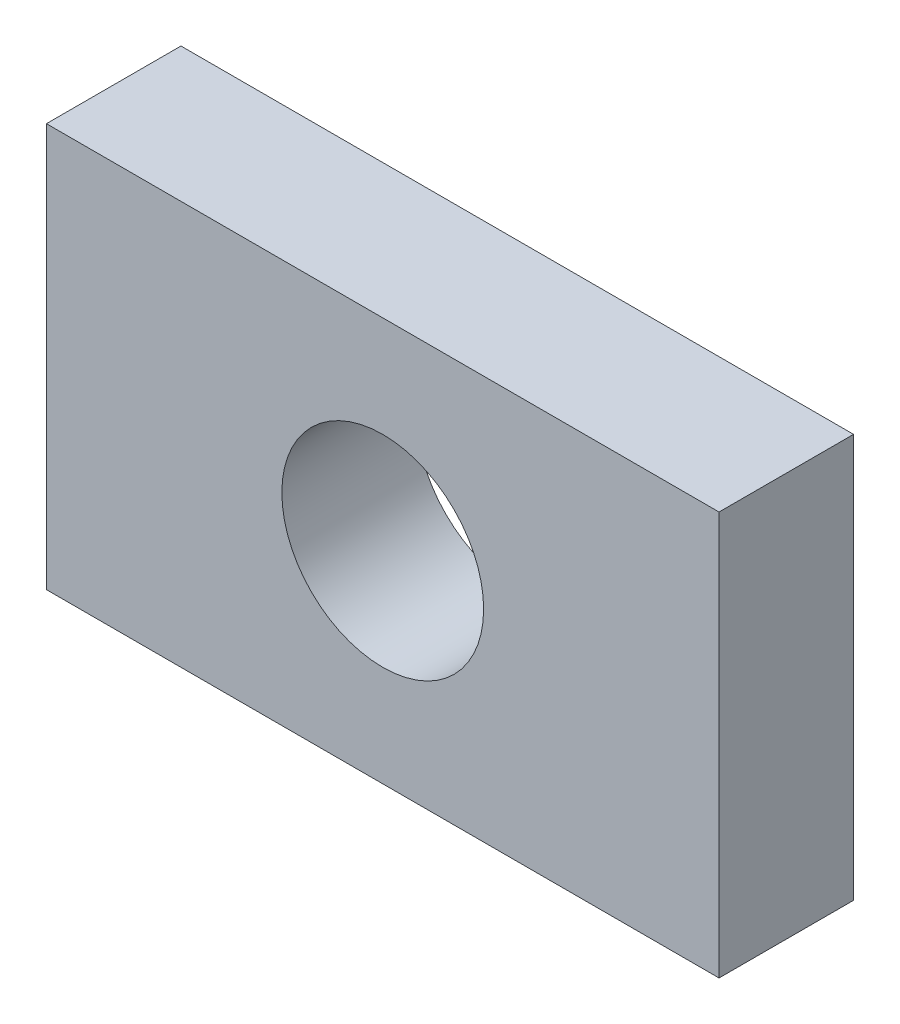
ISO-10303-21;
HEADER;
FILE_DESCRIPTION(('STEP AP214'),'2;1');
FILE_NAME('part.step','',(''),(''),'','','');
FILE_SCHEMA(('AUTOMOTIVE_DESIGN { 1 0 10303 214 1 1 1 1 }'));
ENDSEC;
DATA;
#1=APPLICATION_CONTEXT('core data for automotive mechanical design processes');
#2=APPLICATION_PROTOCOL_DEFINITION('international standard','automotive_design',2000,#1);
#3=PRODUCT_CONTEXT('',#1,'mechanical');
#4=PRODUCT('Part','Part','',(#3));
#5=PRODUCT_RELATED_PRODUCT_CATEGORY('part','',(#4));
#6=PRODUCT_DEFINITION_FORMATION('','',#4);
#7=PRODUCT_DEFINITION_CONTEXT('part definition',#1,'design');
#8=PRODUCT_DEFINITION('design','',#6,#7);
#9=PRODUCT_DEFINITION_SHAPE('','',#8);
#10=(LENGTH_UNIT() NAMED_UNIT(*) SI_UNIT(.MILLI.,.METRE.));
#11=(NAMED_UNIT(*) PLANE_ANGLE_UNIT() SI_UNIT($,.RADIAN.));
#12=(NAMED_UNIT(*) SI_UNIT($,.STERADIAN.) SOLID_ANGLE_UNIT());
#13=UNCERTAINTY_MEASURE_WITH_UNIT(LENGTH_MEASURE(1.E-05),#10,'distance_accuracy_value','');
#14=(GEOMETRIC_REPRESENTATION_CONTEXT(3) GLOBAL_UNCERTAINTY_ASSIGNED_CONTEXT((#13)) GLOBAL_UNIT_ASSIGNED_CONTEXT((#10,
#11,#12)) REPRESENTATION_CONTEXT('',''));
#15=CARTESIAN_POINT('',(0.,0.,0.));
#16=DIRECTION('',(0.,0.,1.));
#17=DIRECTION('',(1.,0.,0.));
#18=AXIS2_PLACEMENT_3D('',#15,#16,#17);
#19=CARTESIAN_POINT('',(0.,0.,2.));
#20=DIRECTION('',(0.,0.,-1.));
#21=DIRECTION('',(-1.,0.,0.));
#22=AXIS2_PLACEMENT_3D('',#19,#20,#21);
#23=PLANE('',#22);
#24=DIRECTION('',(-1.,0.,0.));
#25=VECTOR('',#24,1.);
#26=CARTESIAN_POINT('',(2078.67595263579,1309.13833772904,2.));
#27=LINE('',#26,#25);
#28=CARTESIAN_POINT('',(2088.67595263579,1309.13833772904,2.));
#29=VERTEX_POINT('',#28);
#30=CARTESIAN_POINT('',(2078.67595263579,1309.13833772904,2.));
#31=VERTEX_POINT('',#30);
#32=EDGE_CURVE('E88',#29,#31,#27,.T.);
#33=ORIENTED_EDGE('',*,*,#32,.T.);
#34=DIRECTION('',(0.,-1.,0.));
#35=VECTOR('',#34,1.);
#36=CARTESIAN_POINT('',(2078.67595263579,1309.13833772904,2.));
#37=LINE('',#36,#35);
#38=CARTESIAN_POINT('',(2078.67595263579,1303.13833772904,2.));
#39=VERTEX_POINT('',#38);
#40=EDGE_CURVE('E83',#31,#39,#37,.T.);
#41=ORIENTED_EDGE('',*,*,#40,.T.);
#42=DIRECTION('',(1.,0.,0.));
#43=VECTOR('',#42,1.);
#44=CARTESIAN_POINT('',(2088.67595263579,1303.13833772904,2.));
#45=LINE('',#44,#43);
#46=CARTESIAN_POINT('',(2088.67595263579,1303.13833772904,2.));
#47=VERTEX_POINT('',#46);
#48=EDGE_CURVE('E86',#39,#47,#45,.T.);
#49=ORIENTED_EDGE('',*,*,#48,.T.);
#50=DIRECTION('',(0.,1.,0.));
#51=VECTOR('',#50,1.);
#52=CARTESIAN_POINT('',(2088.67595263579,1309.13833772904,2.));
#53=LINE('',#52,#51);
#54=EDGE_CURVE('E53',#47,#29,#53,.T.);
#55=ORIENTED_EDGE('',*,*,#54,.T.);
#56=EDGE_LOOP('',(#33,#41,#49,#55));
#57=FACE_BOUND('',#56,.T.);
#58=CARTESIAN_POINT('',(2083.67595263579,1306.13833772904,2.));
#59=DIRECTION('',(0.,0.,1.));
#60=DIRECTION('',(1.,0.,0.));
#61=AXIS2_PLACEMENT_3D('',#58,#59,#60);
#62=CIRCLE('',#61,1.50000000000006);
#63=CARTESIAN_POINT('',(2085.17595263579,1306.13833772904,2.));
#64=VERTEX_POINT('',#63);
#65=EDGE_CURVE('E103',#64,#64,#62,.T.);
#66=ORIENTED_EDGE('',*,*,#65,.F.);
#67=EDGE_LOOP('',(#66));
#68=FACE_BOUND('',#67,.T.);
#69=ADVANCED_FACE('F36',(#57,#68),#23,.F.);
#70=CARTESIAN_POINT('',(0.,0.,0.));
#71=DIRECTION('',(0.,0.,-1.));
#72=DIRECTION('',(-1.,0.,0.));
#73=AXIS2_PLACEMENT_3D('',#70,#71,#72);
#74=PLANE('',#73);
#75=DIRECTION('',(-1.,0.,0.));
#76=VECTOR('',#75,1.);
#77=CARTESIAN_POINT('',(2078.67595263579,1309.13833772904,0.));
#78=LINE('',#77,#76);
#79=CARTESIAN_POINT('',(2088.67595263579,1309.13833772904,0.));
#80=VERTEX_POINT('',#79);
#81=CARTESIAN_POINT('',(2078.67595263579,1309.13833772904,0.));
#82=VERTEX_POINT('',#81);
#83=EDGE_CURVE('E100',#80,#82,#78,.T.);
#84=ORIENTED_EDGE('',*,*,#83,.F.);
#85=DIRECTION('',(0.,1.,0.));
#86=VECTOR('',#85,1.);
#87=CARTESIAN_POINT('',(2088.67595263579,1309.13833772904,0.));
#88=LINE('',#87,#86);
#89=CARTESIAN_POINT('',(2088.67595263579,1303.13833772904,0.));
#90=VERTEX_POINT('',#89);
#91=EDGE_CURVE('E76',#90,#80,#88,.T.);
#92=ORIENTED_EDGE('',*,*,#91,.F.);
#93=DIRECTION('',(1.,0.,0.));
#94=VECTOR('',#93,1.);
#95=CARTESIAN_POINT('',(2088.67595263579,1303.13833772904,0.));
#96=LINE('',#95,#94);
#97=CARTESIAN_POINT('',(2078.67595263579,1303.13833772904,0.));
#98=VERTEX_POINT('',#97);
#99=EDGE_CURVE('E70',#98,#90,#96,.T.);
#100=ORIENTED_EDGE('',*,*,#99,.F.);
#101=DIRECTION('',(0.,-1.,0.));
#102=VECTOR('',#101,1.);
#103=CARTESIAN_POINT('',(2078.67595263579,1309.13833772904,0.));
#104=LINE('',#103,#102);
#105=EDGE_CURVE('E92',#82,#98,#104,.T.);
#106=ORIENTED_EDGE('',*,*,#105,.F.);
#107=EDGE_LOOP('',(#84,#92,#100,#106));
#108=FACE_BOUND('',#107,.T.);
#109=CARTESIAN_POINT('',(2083.67595263579,1306.13833772904,0.));
#110=DIRECTION('',(0.,0.,1.));
#111=DIRECTION('',(1.,0.,0.));
#112=AXIS2_PLACEMENT_3D('',#109,#110,#111);
#113=CIRCLE('',#112,1.50000000000006);
#114=CARTESIAN_POINT('',(2085.17595263579,1306.13833772904,0.));
#115=VERTEX_POINT('',#114);
#116=EDGE_CURVE('E115',#115,#115,#113,.T.);
#117=ORIENTED_EDGE('',*,*,#116,.T.);
#118=EDGE_LOOP('',(#117));
#119=FACE_BOUND('',#118,.T.);
#120=ADVANCED_FACE('F111',(#108,#119),#74,.T.);
#121=CARTESIAN_POINT('',(2078.67595263579,1309.13833772904,2.));
#122=DIRECTION('',(0.,-1.,0.));
#123=DIRECTION('',(0.,0.,-1.));
#124=AXIS2_PLACEMENT_3D('',#121,#122,#123);
#125=PLANE('',#124);
#126=ORIENTED_EDGE('',*,*,#83,.T.);
#127=DIRECTION('',(0.,0.,-1.));
#128=VECTOR('',#127,1.);
#129=CARTESIAN_POINT('',(2078.67595263579,1309.13833772904,2.));
#130=LINE('',#129,#128);
#131=EDGE_CURVE('E11',#31,#82,#130,.T.);
#132=ORIENTED_EDGE('',*,*,#131,.F.);
#133=ORIENTED_EDGE('',*,*,#32,.F.);
#134=DIRECTION('',(0.,0.,-1.));
#135=VECTOR('',#134,1.);
#136=CARTESIAN_POINT('',(2088.67595263579,1309.13833772904,2.));
#137=LINE('',#136,#135);
#138=EDGE_CURVE('E96',#29,#80,#137,.T.);
#139=ORIENTED_EDGE('',*,*,#138,.T.);
#140=EDGE_LOOP('',(#126,#132,#133,#139));
#141=FACE_BOUND('',#140,.T.);
#142=ADVANCED_FACE('F38',(#141),#125,.F.);
#143=CARTESIAN_POINT('',(2078.67595263579,1309.13833772904,2.));
#144=DIRECTION('',(1.,0.,0.));
#145=DIRECTION('',(0.,0.,-1.));
#146=AXIS2_PLACEMENT_3D('',#143,#144,#145);
#147=PLANE('',#146);
#148=ORIENTED_EDGE('',*,*,#105,.T.);
#149=DIRECTION('',(0.,0.,-1.));
#150=VECTOR('',#149,1.);
#151=CARTESIAN_POINT('',(2078.67595263579,1303.13833772904,2.));
#152=LINE('',#151,#150);
#153=EDGE_CURVE('E45',#39,#98,#152,.T.);
#154=ORIENTED_EDGE('',*,*,#153,.F.);
#155=ORIENTED_EDGE('',*,*,#40,.F.);
#156=ORIENTED_EDGE('',*,*,#131,.T.);
#157=EDGE_LOOP('',(#148,#154,#155,#156));
#158=FACE_BOUND('',#157,.T.);
#159=ADVANCED_FACE('F91',(#158),#147,.F.);
#160=CARTESIAN_POINT('',(2088.67595263579,1303.13833772904,2.));
#161=DIRECTION('',(0.,1.,0.));
#162=DIRECTION('',(0.,0.,1.));
#163=AXIS2_PLACEMENT_3D('',#160,#161,#162);
#164=PLANE('',#163);
#165=ORIENTED_EDGE('',*,*,#99,.T.);
#166=DIRECTION('',(0.,0.,-1.));
#167=VECTOR('',#166,1.);
#168=CARTESIAN_POINT('',(2088.67595263579,1303.13833772904,2.));
#169=LINE('',#168,#167);
#170=EDGE_CURVE('E93',#47,#90,#169,.T.);
#171=ORIENTED_EDGE('',*,*,#170,.F.);
#172=ORIENTED_EDGE('',*,*,#48,.F.);
#173=ORIENTED_EDGE('',*,*,#153,.T.);
#174=EDGE_LOOP('',(#165,#171,#172,#173));
#175=FACE_BOUND('',#174,.T.);
#176=ADVANCED_FACE('F94',(#175),#164,.F.);
#177=CARTESIAN_POINT('',(2088.67595263579,1309.13833772904,2.));
#178=DIRECTION('',(-1.,0.,0.));
#179=DIRECTION('',(0.,-1.,0.));
#180=AXIS2_PLACEMENT_3D('',#177,#178,#179);
#181=PLANE('',#180);
#182=ORIENTED_EDGE('',*,*,#91,.T.);
#183=ORIENTED_EDGE('',*,*,#138,.F.);
#184=ORIENTED_EDGE('',*,*,#54,.F.);
#185=ORIENTED_EDGE('',*,*,#170,.T.);
#186=EDGE_LOOP('',(#182,#183,#184,#185));
#187=FACE_BOUND('',#186,.T.);
#188=ADVANCED_FACE('F108',(#187),#181,.F.);
#189=CARTESIAN_POINT('',(2083.67595263579,1306.13833772904,2.));
#190=DIRECTION('',(0.,0.,-1.));
#191=DIRECTION('',(-1.,0.,0.));
#192=AXIS2_PLACEMENT_3D('',#189,#190,#191);
#193=CYLINDRICAL_SURFACE('',#192,1.50000000000006);
#194=ORIENTED_EDGE('',*,*,#65,.T.);
#195=EDGE_LOOP('',(#194));
#196=FACE_BOUND('',#195,.T.);
#197=ORIENTED_EDGE('',*,*,#116,.F.);
#198=EDGE_LOOP('',(#197));
#199=FACE_BOUND('',#198,.T.);
#200=ADVANCED_FACE('F121',(#196,#199),#193,.F.);
#201=CLOSED_SHELL('',(#69,#120,#142,#159,#176,#188,#200));
#202=MANIFOLD_SOLID_BREP('B2',#201);
#203=ADVANCED_BREP_SHAPE_REPRESENTATION('',(#18,#202),#14);
#204=SHAPE_DEFINITION_REPRESENTATION(#9,#203);
ENDSEC;
END-ISO-10303-21;
